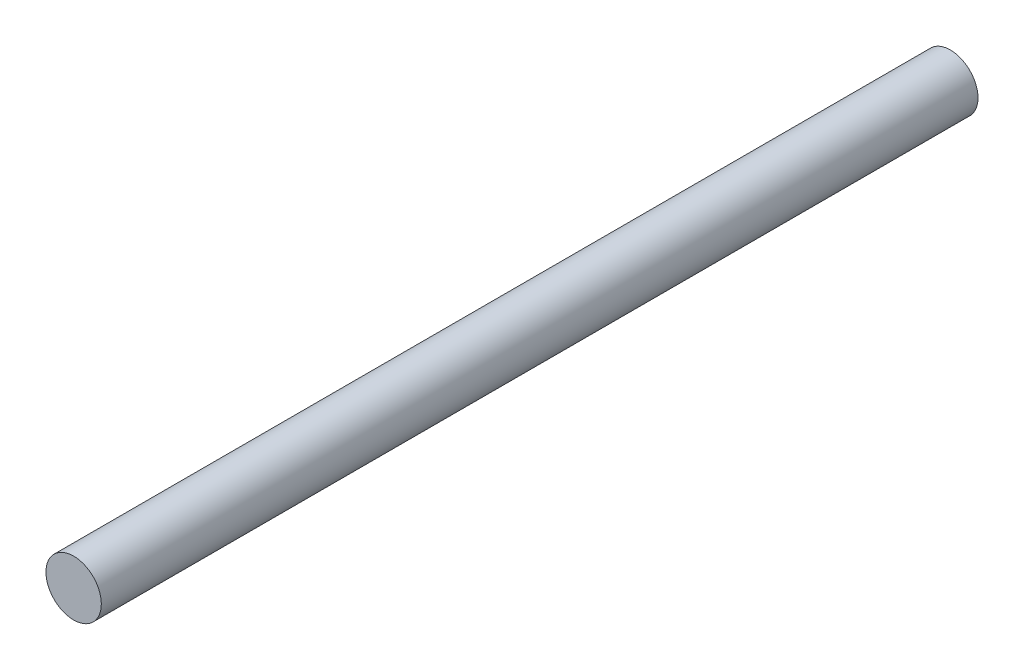
ISO-10303-21;
HEADER;
FILE_DESCRIPTION(('STEP AP214'),'2;1');
FILE_NAME('part.step','',(''),(''),'','','');
FILE_SCHEMA(('AUTOMOTIVE_DESIGN { 1 0 10303 214 1 1 1 1 }'));
ENDSEC;
DATA;
#1=APPLICATION_CONTEXT('core data for automotive mechanical design processes');
#2=APPLICATION_PROTOCOL_DEFINITION('international standard','automotive_design',2000,#1);
#3=PRODUCT_CONTEXT('',#1,'mechanical');
#4=PRODUCT('Part','Part','',(#3));
#5=PRODUCT_RELATED_PRODUCT_CATEGORY('part','',(#4));
#6=PRODUCT_DEFINITION_FORMATION('','',#4);
#7=PRODUCT_DEFINITION_CONTEXT('part definition',#1,'design');
#8=PRODUCT_DEFINITION('design','',#6,#7);
#9=PRODUCT_DEFINITION_SHAPE('','',#8);
#10=(LENGTH_UNIT() NAMED_UNIT(*) SI_UNIT(.MILLI.,.METRE.));
#11=(NAMED_UNIT(*) PLANE_ANGLE_UNIT() SI_UNIT($,.RADIAN.));
#12=(NAMED_UNIT(*) SI_UNIT($,.STERADIAN.) SOLID_ANGLE_UNIT());
#13=UNCERTAINTY_MEASURE_WITH_UNIT(LENGTH_MEASURE(1.E-05),#10,'distance_accuracy_value','');
#14=(GEOMETRIC_REPRESENTATION_CONTEXT(3) GLOBAL_UNCERTAINTY_ASSIGNED_CONTEXT((#13)) GLOBAL_UNIT_ASSIGNED_CONTEXT((#10,
#11,#12)) REPRESENTATION_CONTEXT('',''));
#15=CARTESIAN_POINT('',(0.,0.,0.));
#16=DIRECTION('',(0.,0.,1.));
#17=DIRECTION('',(1.,0.,0.));
#18=AXIS2_PLACEMENT_3D('',#15,#16,#17);
#19=CARTESIAN_POINT('',(0.,0.,95.));
#20=DIRECTION('',(0.,0.,-1.));
#21=DIRECTION('',(-1.,0.,0.));
#22=AXIS2_PLACEMENT_3D('',#19,#20,#21);
#23=CYLINDRICAL_SURFACE('',#22,3.);
#24=CARTESIAN_POINT('',(0.,0.,95.));
#25=DIRECTION('',(0.,0.,1.));
#26=DIRECTION('',(1.,0.,0.));
#27=AXIS2_PLACEMENT_3D('',#24,#25,#26);
#28=CIRCLE('',#27,3.);
#29=CARTESIAN_POINT('',(3.,0.,95.));
#30=VERTEX_POINT('',#29);
#31=EDGE_CURVE('E10',#30,#30,#28,.T.);
#32=ORIENTED_EDGE('',*,*,#31,.F.);
#33=EDGE_LOOP('',(#32));
#34=FACE_BOUND('',#33,.T.);
#35=CARTESIAN_POINT('',(0.,0.,0.));
#36=DIRECTION('',(0.,0.,1.));
#37=DIRECTION('',(1.,0.,0.));
#38=AXIS2_PLACEMENT_3D('',#35,#36,#37);
#39=CIRCLE('',#38,3.);
#40=CARTESIAN_POINT('',(3.,0.,0.));
#41=VERTEX_POINT('',#40);
#42=EDGE_CURVE('E38',#41,#41,#39,.T.);
#43=ORIENTED_EDGE('',*,*,#42,.T.);
#44=EDGE_LOOP('',(#43));
#45=FACE_BOUND('',#44,.T.);
#46=ADVANCED_FACE('F35',(#34,#45),#23,.T.);
#47=CARTESIAN_POINT('',(0.,0.,95.));
#48=DIRECTION('',(0.,0.,1.));
#49=DIRECTION('',(1.,0.,0.));
#50=AXIS2_PLACEMENT_3D('',#47,#48,#49);
#51=PLANE('',#50);
#52=ORIENTED_EDGE('',*,*,#31,.T.);
#53=EDGE_LOOP('',(#52));
#54=FACE_BOUND('',#53,.T.);
#55=ADVANCED_FACE('F50',(#54),#51,.T.);
#56=CARTESIAN_POINT('',(0.,0.,0.));
#57=DIRECTION('',(0.,0.,1.));
#58=DIRECTION('',(1.,0.,0.));
#59=AXIS2_PLACEMENT_3D('',#56,#57,#58);
#60=PLANE('',#59);
#61=ORIENTED_EDGE('',*,*,#42,.F.);
#62=EDGE_LOOP('',(#61));
#63=FACE_BOUND('',#62,.T.);
#64=ADVANCED_FACE('F48',(#63),#60,.F.);
#65=CLOSED_SHELL('',(#46,#55,#64));
#66=MANIFOLD_SOLID_BREP('B2',#65);
#67=ADVANCED_BREP_SHAPE_REPRESENTATION('',(#18,#66),#14);
#68=SHAPE_DEFINITION_REPRESENTATION(#9,#67);
ENDSEC;
END-ISO-10303-21;
